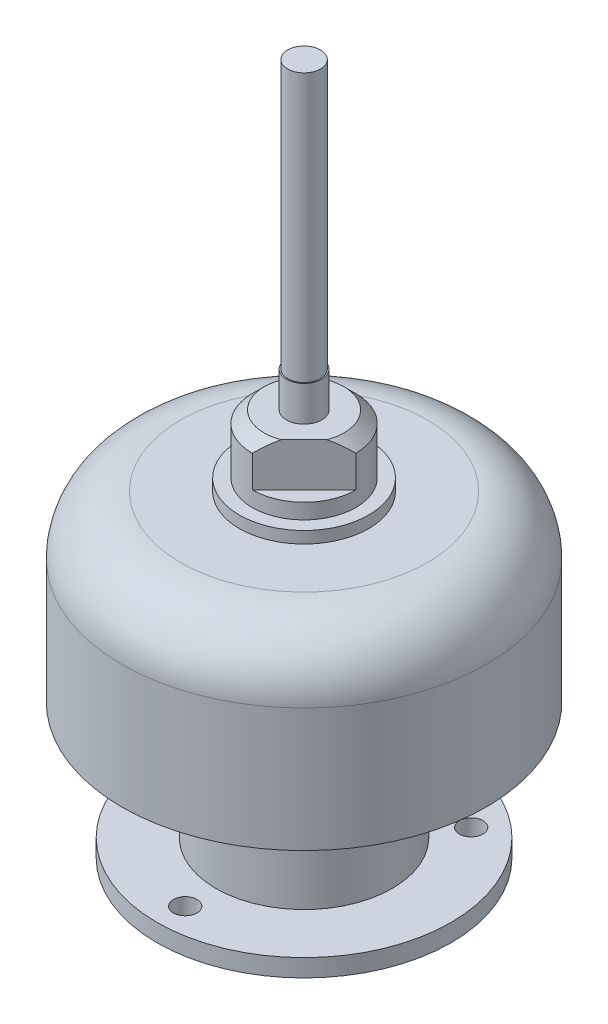
ISO-10303-21;
HEADER;
FILE_DESCRIPTION(('STEP AP214'),'2;1');
FILE_NAME('part.step','',(''),(''),'','','');
FILE_SCHEMA(('AUTOMOTIVE_DESIGN { 1 0 10303 214 1 1 1 1 }'));
ENDSEC;
DATA;
#1=APPLICATION_CONTEXT('core data for automotive mechanical design processes');
#2=APPLICATION_PROTOCOL_DEFINITION('international standard','automotive_design',2000,#1);
#3=PRODUCT_CONTEXT('',#1,'mechanical');
#4=PRODUCT('Part','Part','',(#3));
#5=PRODUCT_RELATED_PRODUCT_CATEGORY('part','',(#4));
#6=PRODUCT_DEFINITION_FORMATION('','',#4);
#7=PRODUCT_DEFINITION_CONTEXT('part definition',#1,'design');
#8=PRODUCT_DEFINITION('design','',#6,#7);
#9=PRODUCT_DEFINITION_SHAPE('','',#8);
#10=(LENGTH_UNIT() NAMED_UNIT(*) SI_UNIT(.MILLI.,.METRE.));
#11=(NAMED_UNIT(*) PLANE_ANGLE_UNIT() SI_UNIT($,.RADIAN.));
#12=(NAMED_UNIT(*) SI_UNIT($,.STERADIAN.) SOLID_ANGLE_UNIT());
#13=UNCERTAINTY_MEASURE_WITH_UNIT(LENGTH_MEASURE(1.E-05),#10,'distance_accuracy_value','');
#14=(GEOMETRIC_REPRESENTATION_CONTEXT(3) GLOBAL_UNCERTAINTY_ASSIGNED_CONTEXT((#13)) GLOBAL_UNIT_ASSIGNED_CONTEXT((#10,
#11,#12)) REPRESENTATION_CONTEXT('',''));
#15=CARTESIAN_POINT('',(0.,0.,0.));
#16=DIRECTION('',(0.,0.,1.));
#17=DIRECTION('',(1.,0.,0.));
#18=AXIS2_PLACEMENT_3D('',#15,#16,#17);
#19=CARTESIAN_POINT('',(0.,2.,0.));
#20=DIRECTION('',(0.,-1.,0.));
#21=DIRECTION('',(0.,0.,-1.));
#22=AXIS2_PLACEMENT_3D('',#19,#20,#21);
#23=PLANE('',#22);
#24=CARTESIAN_POINT('',(0.,2.,0.));
#25=DIRECTION('',(0.,-1.,0.));
#26=DIRECTION('',(0.,0.,-1.));
#27=AXIS2_PLACEMENT_3D('',#24,#25,#26);
#28=CIRCLE('',#27,4.4);
#29=CARTESIAN_POINT('',(0.,2.,-4.4));
#30=VERTEX_POINT('',#29);
#31=EDGE_CURVE('E259',#30,#30,#28,.T.);
#32=ORIENTED_EDGE('',*,*,#31,.T.);
#33=EDGE_LOOP('',(#32));
#34=FACE_BOUND('',#33,.T.);
#35=CARTESIAN_POINT('',(0.,2.,0.));
#36=DIRECTION('',(0.,-1.,0.));
#37=DIRECTION('',(0.,0.,-1.));
#38=AXIS2_PLACEMENT_3D('',#35,#36,#37);
#39=CIRCLE('',#38,1.5);
#40=CARTESIAN_POINT('',(0.,2.,-1.5));
#41=VERTEX_POINT('',#40);
#42=EDGE_CURVE('E266',#41,#41,#39,.T.);
#43=ORIENTED_EDGE('',*,*,#42,.F.);
#44=EDGE_LOOP('',(#43));
#45=FACE_BOUND('',#44,.T.);
#46=ADVANCED_FACE('F31',(#34,#45),#23,.T.);
#47=CARTESIAN_POINT('',(0.,36.,0.));
#48=DIRECTION('',(0.,1.,0.));
#49=DIRECTION('',(0.,0.,1.));
#50=AXIS2_PLACEMENT_3D('',#47,#48,#49);
#51=PLANE('',#50);
#52=CARTESIAN_POINT('',(0.,36.,0.));
#53=DIRECTION('',(0.,1.,0.));
#54=DIRECTION('',(0.,0.,1.));
#55=AXIS2_PLACEMENT_3D('',#52,#53,#54);
#56=CIRCLE('',#55,1.5);
#57=CARTESIAN_POINT('',(0.,36.,1.5));
#58=VERTEX_POINT('',#57);
#59=EDGE_CURVE('E247',#58,#58,#56,.T.);
#60=ORIENTED_EDGE('',*,*,#59,.T.);
#61=EDGE_LOOP('',(#60));
#62=FACE_BOUND('',#61,.T.);
#63=CARTESIAN_POINT('',(0.,36.,0.));
#64=DIRECTION('',(0.,1.,0.));
#65=DIRECTION('',(0.,0.,1.));
#66=AXIS2_PLACEMENT_3D('',#63,#64,#65);
#67=CIRCLE('',#66,1.4);
#68=CARTESIAN_POINT('',(0.,36.,1.4));
#69=VERTEX_POINT('',#68);
#70=EDGE_CURVE('E255',#69,#69,#67,.T.);
#71=ORIENTED_EDGE('',*,*,#70,.F.);
#72=EDGE_LOOP('',(#71));
#73=FACE_BOUND('',#72,.T.);
#74=ADVANCED_FACE('F213',(#62,#73),#51,.T.);
#75=CARTESIAN_POINT('',(0.,33.,0.));
#76=DIRECTION('',(0.,1.,0.));
#77=DIRECTION('',(0.,0.,1.));
#78=AXIS2_PLACEMENT_3D('',#75,#76,#77);
#79=PLANE('',#78);
#80=DIRECTION('',(0.707106781186548,0.,-0.707106781186548));
#81=VECTOR('',#80,1.);
#82=CARTESIAN_POINT('',(0.,33.,-4.4));
#83=LINE('',#82,#81);
#84=CARTESIAN_POINT('',(-3.16953597148326,33.,-1.23046402851675));
#85=VERTEX_POINT('',#84);
#86=CARTESIAN_POINT('',(-1.23046402851674,33.,-3.16953597148326));
#87=VERTEX_POINT('',#86);
#88=EDGE_CURVE('E109',#85,#87,#83,.T.);
#89=ORIENTED_EDGE('',*,*,#88,.F.);
#90=CARTESIAN_POINT('',(0.,33.,0.));
#91=DIRECTION('',(0.,1.,0.));
#92=DIRECTION('',(0.,0.,1.));
#93=AXIS2_PLACEMENT_3D('',#90,#91,#92);
#94=CIRCLE('',#93,3.4);
#95=CARTESIAN_POINT('',(1.23046402851674,33.,3.16953597148326));
#96=VERTEX_POINT('',#95);
#97=EDGE_CURVE('E162',#85,#96,#94,.T.);
#98=ORIENTED_EDGE('',*,*,#97,.T.);
#99=DIRECTION('',(-0.707106781186548,0.,0.707106781186548));
#100=VECTOR('',#99,1.);
#101=CARTESIAN_POINT('',(4.4,33.,0.));
#102=LINE('',#101,#100);
#103=CARTESIAN_POINT('',(3.16953597148326,33.,1.23046402851674));
#104=VERTEX_POINT('',#103);
#105=EDGE_CURVE('E94',#104,#96,#102,.T.);
#106=ORIENTED_EDGE('',*,*,#105,.F.);
#107=CARTESIAN_POINT('',(0.,33.,0.));
#108=DIRECTION('',(0.,1.,0.));
#109=DIRECTION('',(0.,0.,1.));
#110=AXIS2_PLACEMENT_3D('',#107,#108,#109);
#111=CIRCLE('',#110,3.4);
#112=EDGE_CURVE('E159',#104,#87,#111,.T.);
#113=ORIENTED_EDGE('',*,*,#112,.T.);
#114=EDGE_LOOP('',(#89,#98,#106,#113));
#115=FACE_BOUND('',#114,.T.);
#116=CARTESIAN_POINT('',(0.,33.,0.));
#117=DIRECTION('',(0.,1.,0.));
#118=DIRECTION('',(0.,0.,1.));
#119=AXIS2_PLACEMENT_3D('',#116,#117,#118);
#120=CIRCLE('',#119,1.5);
#121=CARTESIAN_POINT('',(0.,33.,1.5));
#122=VERTEX_POINT('',#121);
#123=EDGE_CURVE('E250',#122,#122,#120,.T.);
#124=ORIENTED_EDGE('',*,*,#123,.F.);
#125=EDGE_LOOP('',(#124));
#126=FACE_BOUND('',#125,.T.);
#127=ADVANCED_FACE('F189',(#115,#126),#79,.T.);
#128=CARTESIAN_POINT('',(0.,28.,0.));
#129=DIRECTION('',(0.,1.,0.));
#130=DIRECTION('',(0.,0.,1.));
#131=AXIS2_PLACEMENT_3D('',#128,#129,#130);
#132=PLANE('',#131);
#133=CARTESIAN_POINT('',(0.,28.,0.));
#134=DIRECTION('',(0.,1.,0.));
#135=DIRECTION('',(0.,0.,1.));
#136=AXIS2_PLACEMENT_3D('',#133,#134,#135);
#137=CIRCLE('',#136,5.50000000000001);
#138=CARTESIAN_POINT('',(0.,28.,5.50000000000001));
#139=VERTEX_POINT('',#138);
#140=EDGE_CURVE('E127',#139,#139,#137,.T.);
#141=ORIENTED_EDGE('',*,*,#140,.T.);
#142=EDGE_LOOP('',(#141));
#143=FACE_BOUND('',#142,.T.);
#144=CARTESIAN_POINT('',(0.,28.,0.));
#145=DIRECTION('',(0.,1.,0.));
#146=DIRECTION('',(0.,0.,1.));
#147=AXIS2_PLACEMENT_3D('',#144,#145,#146);
#148=CIRCLE('',#147,4.4);
#149=CARTESIAN_POINT('',(0.,28.,4.4));
#150=VERTEX_POINT('',#149);
#151=EDGE_CURVE('E122',#150,#150,#148,.T.);
#152=ORIENTED_EDGE('',*,*,#151,.F.);
#153=EDGE_LOOP('',(#152));
#154=FACE_BOUND('',#153,.T.);
#155=ADVANCED_FACE('F335',(#143,#154),#132,.T.);
#156=CARTESIAN_POINT('',(0.,27.,0.));
#157=DIRECTION('',(0.,1.,0.));
#158=DIRECTION('',(0.,0.,1.));
#159=AXIS2_PLACEMENT_3D('',#156,#157,#158);
#160=PLANE('',#159);
#161=CARTESIAN_POINT('',(0.,27.,0.));
#162=DIRECTION('',(0.,1.,0.));
#163=DIRECTION('',(0.,0.,1.));
#164=AXIS2_PLACEMENT_3D('',#161,#162,#163);
#165=CIRCLE('',#164,10.5);
#166=CARTESIAN_POINT('',(0.,27.,10.5));
#167=VERTEX_POINT('',#166);
#168=EDGE_CURVE('E151',#167,#167,#165,.T.);
#169=ORIENTED_EDGE('',*,*,#168,.T.);
#170=EDGE_LOOP('',(#169));
#171=FACE_BOUND('',#170,.T.);
#172=CARTESIAN_POINT('',(0.,27.,0.));
#173=DIRECTION('',(0.,1.,0.));
#174=DIRECTION('',(0.,0.,1.));
#175=AXIS2_PLACEMENT_3D('',#172,#173,#174);
#176=CIRCLE('',#175,5.50000000000001);
#177=CARTESIAN_POINT('',(0.,27.,5.50000000000001));
#178=VERTEX_POINT('',#177);
#179=EDGE_CURVE('E126',#178,#178,#176,.T.);
#180=ORIENTED_EDGE('',*,*,#179,.F.);
#181=EDGE_LOOP('',(#180));
#182=FACE_BOUND('',#181,.T.);
#183=ADVANCED_FACE('F332',(#171,#182),#160,.T.);
#184=CARTESIAN_POINT('',(0.,6.5,0.));
#185=DIRECTION('',(0.,1.,0.));
#186=DIRECTION('',(0.,0.,1.));
#187=AXIS2_PLACEMENT_3D('',#184,#185,#186);
#188=PLANE('',#187);
#189=CARTESIAN_POINT('',(0.,6.5,0.));
#190=DIRECTION('',(0.,1.,0.));
#191=DIRECTION('',(0.,0.,1.));
#192=AXIS2_PLACEMENT_3D('',#189,#190,#191);
#193=CIRCLE('',#192,7.5);
#194=CARTESIAN_POINT('',(0.,6.5,7.5));
#195=VERTEX_POINT('',#194);
#196=EDGE_CURVE('E142',#195,#195,#193,.T.);
#197=ORIENTED_EDGE('',*,*,#196,.T.);
#198=EDGE_LOOP('',(#197));
#199=FACE_BOUND('',#198,.T.);
#200=CARTESIAN_POINT('',(0.,6.5,0.));
#201=DIRECTION('',(0.,1.,0.));
#202=DIRECTION('',(0.,0.,1.));
#203=AXIS2_PLACEMENT_3D('',#200,#201,#202);
#204=CIRCLE('',#203,5.);
#205=CARTESIAN_POINT('',(0.,6.5,5.));
#206=VERTEX_POINT('',#205);
#207=EDGE_CURVE('E135',#206,#206,#204,.T.);
#208=ORIENTED_EDGE('',*,*,#207,.F.);
#209=EDGE_LOOP('',(#208));
#210=FACE_BOUND('',#209,.T.);
#211=ADVANCED_FACE('F313',(#199,#210),#188,.T.);
#212=CARTESIAN_POINT('',(0.,1.5,0.));
#213=DIRECTION('',(0.,1.,0.));
#214=DIRECTION('',(0.,0.,1.));
#215=AXIS2_PLACEMENT_3D('',#212,#213,#214);
#216=PLANE('',#215);
#217=CARTESIAN_POINT('',(-6.35,1.5,-7.85772410593551));
#218=DIRECTION('',(0.,1.,0.));
#219=DIRECTION('',(0.,0.,1.));
#220=AXIS2_PLACEMENT_3D('',#217,#218,#219);
#221=CIRCLE('',#220,1.);
#222=CARTESIAN_POINT('',(-6.35,1.5,-6.85772410593551));
#223=VERTEX_POINT('',#222);
#224=EDGE_CURVE('E283',#223,#223,#221,.F.);
#225=ORIENTED_EDGE('',*,*,#224,.T.);
#226=EDGE_LOOP('',(#225));
#227=FACE_BOUND('',#226,.T.);
#228=CARTESIAN_POINT('',(6.35,1.5,-7.85772410593551));
#229=DIRECTION('',(0.,1.,0.));
#230=DIRECTION('',(0.,0.,1.));
#231=AXIS2_PLACEMENT_3D('',#228,#229,#230);
#232=CIRCLE('',#231,1.);
#233=CARTESIAN_POINT('',(6.35,1.5,-6.85772410593551));
#234=VERTEX_POINT('',#233);
#235=EDGE_CURVE('E277',#234,#234,#232,.F.);
#236=ORIENTED_EDGE('',*,*,#235,.T.);
#237=EDGE_LOOP('',(#236));
#238=FACE_BOUND('',#237,.T.);
#239=CARTESIAN_POINT('',(0.,1.5,10.1027881362028));
#240=DIRECTION('',(0.,1.,0.));
#241=DIRECTION('',(0.,0.,1.));
#242=AXIS2_PLACEMENT_3D('',#239,#240,#241);
#243=CIRCLE('',#242,1.);
#244=CARTESIAN_POINT('',(0.,1.5,11.1027881362028));
#245=VERTEX_POINT('',#244);
#246=EDGE_CURVE('E274',#245,#245,#243,.F.);
#247=ORIENTED_EDGE('',*,*,#246,.T.);
#248=EDGE_LOOP('',(#247));
#249=FACE_BOUND('',#248,.T.);
#250=CARTESIAN_POINT('',(0.,1.5,0.));
#251=DIRECTION('',(0.,1.,0.));
#252=DIRECTION('',(0.,0.,1.));
#253=AXIS2_PLACEMENT_3D('',#250,#251,#252);
#254=CIRCLE('',#253,12.5);
#255=CARTESIAN_POINT('',(0.,1.5,12.5));
#256=VERTEX_POINT('',#255);
#257=EDGE_CURVE('E148',#256,#256,#254,.T.);
#258=ORIENTED_EDGE('',*,*,#257,.T.);
#259=EDGE_LOOP('',(#258));
#260=FACE_BOUND('',#259,.T.);
#261=CARTESIAN_POINT('',(0.,1.5,0.));
#262=DIRECTION('',(0.,1.,0.));
#263=DIRECTION('',(0.,0.,1.));
#264=AXIS2_PLACEMENT_3D('',#261,#262,#263);
#265=CIRCLE('',#264,7.5);
#266=CARTESIAN_POINT('',(0.,1.5,7.5));
#267=VERTEX_POINT('',#266);
#268=EDGE_CURVE('E139',#267,#267,#265,.T.);
#269=ORIENTED_EDGE('',*,*,#268,.F.);
#270=EDGE_LOOP('',(#269));
#271=FACE_BOUND('',#270,.T.);
#272=ADVANCED_FACE('F307',(#227,#238,#249,#260,#271),#216,.T.);
#273=CARTESIAN_POINT('',(0.,1.5,0.));
#274=DIRECTION('',(0.,-1.,0.));
#275=DIRECTION('',(0.,0.,-1.));
#276=AXIS2_PLACEMENT_3D('',#273,#274,#275);
#277=CYLINDRICAL_SURFACE('',#276,12.5);
#278=ORIENTED_EDGE('',*,*,#257,.F.);
#279=EDGE_LOOP('',(#278));
#280=FACE_BOUND('',#279,.T.);
#281=CARTESIAN_POINT('',(0.,0.,0.));
#282=DIRECTION('',(0.,1.,0.));
#283=DIRECTION('',(0.,0.,1.));
#284=AXIS2_PLACEMENT_3D('',#281,#282,#283);
#285=CIRCLE('',#284,12.5);
#286=CARTESIAN_POINT('',(0.,0.,12.5));
#287=VERTEX_POINT('',#286);
#288=EDGE_CURVE('E145',#287,#287,#285,.T.);
#289=ORIENTED_EDGE('',*,*,#288,.T.);
#290=EDGE_LOOP('',(#289));
#291=FACE_BOUND('',#290,.T.);
#292=ADVANCED_FACE('F296',(#280,#291),#277,.T.);
#293=CARTESIAN_POINT('',(0.,0.,0.));
#294=DIRECTION('',(0.,1.,0.));
#295=DIRECTION('',(0.,0.,1.));
#296=AXIS2_PLACEMENT_3D('',#293,#294,#295);
#297=PLANE('',#296);
#298=CARTESIAN_POINT('',(-6.35,0.,-7.85772410593551));
#299=DIRECTION('',(0.,-1.,0.));
#300=DIRECTION('',(0.,0.,-1.));
#301=AXIS2_PLACEMENT_3D('',#298,#299,#300);
#302=CIRCLE('',#301,1.);
#303=CARTESIAN_POINT('',(-6.35,0.,-8.85772410593551));
#304=VERTEX_POINT('',#303);
#305=EDGE_CURVE('E286',#304,#304,#302,.T.);
#306=ORIENTED_EDGE('',*,*,#305,.F.);
#307=EDGE_LOOP('',(#306));
#308=FACE_BOUND('',#307,.T.);
#309=CARTESIAN_POINT('',(6.35,0.,-7.85772410593551));
#310=DIRECTION('',(0.,-1.,0.));
#311=DIRECTION('',(0.,0.,-1.));
#312=AXIS2_PLACEMENT_3D('',#309,#310,#311);
#313=CIRCLE('',#312,1.);
#314=CARTESIAN_POINT('',(6.35,0.,-8.85772410593551));
#315=VERTEX_POINT('',#314);
#316=EDGE_CURVE('E280',#315,#315,#313,.T.);
#317=ORIENTED_EDGE('',*,*,#316,.F.);
#318=EDGE_LOOP('',(#317));
#319=FACE_BOUND('',#318,.T.);
#320=CARTESIAN_POINT('',(0.,0.,10.1027881362028));
#321=DIRECTION('',(0.,-1.,0.));
#322=DIRECTION('',(0.,0.,-1.));
#323=AXIS2_PLACEMENT_3D('',#320,#321,#322);
#324=CIRCLE('',#323,1.);
#325=CARTESIAN_POINT('',(0.,0.,9.1027881362028));
#326=VERTEX_POINT('',#325);
#327=EDGE_CURVE('E269',#326,#326,#324,.T.);
#328=ORIENTED_EDGE('',*,*,#327,.F.);
#329=EDGE_LOOP('',(#328));
#330=FACE_BOUND('',#329,.T.);
#331=CARTESIAN_POINT('',(0.,0.,0.));
#332=DIRECTION('',(0.,-1.,0.));
#333=DIRECTION('',(0.,0.,-1.));
#334=AXIS2_PLACEMENT_3D('',#331,#332,#333);
#335=CIRCLE('',#334,4.4);
#336=CARTESIAN_POINT('',(0.,0.,-4.4));
#337=VERTEX_POINT('',#336);
#338=EDGE_CURVE('E261',#337,#337,#335,.T.);
#339=ORIENTED_EDGE('',*,*,#338,.F.);
#340=EDGE_LOOP('',(#339));
#341=FACE_BOUND('',#340,.T.);
#342=ORIENTED_EDGE('',*,*,#288,.F.);
#343=EDGE_LOOP('',(#342));
#344=FACE_BOUND('',#343,.T.);
#345=ADVANCED_FACE('F292',(#308,#319,#330,#341,#344),#297,.F.);
#346=CARTESIAN_POINT('',(0.,6.5,0.));
#347=DIRECTION('',(0.,-1.,0.));
#348=DIRECTION('',(0.,0.,-1.));
#349=AXIS2_PLACEMENT_3D('',#346,#347,#348);
#350=CYLINDRICAL_SURFACE('',#349,7.5);
#351=ORIENTED_EDGE('',*,*,#196,.F.);
#352=EDGE_LOOP('',(#351));
#353=FACE_BOUND('',#352,.T.);
#354=ORIENTED_EDGE('',*,*,#268,.T.);
#355=EDGE_LOOP('',(#354));
#356=FACE_BOUND('',#355,.T.);
#357=ADVANCED_FACE('F295',(#353,#356),#350,.T.);
#358=CARTESIAN_POINT('',(0.,11.5,0.));
#359=DIRECTION('',(0.,-1.,0.));
#360=DIRECTION('',(0.,0.,-1.));
#361=AXIS2_PLACEMENT_3D('',#358,#359,#360);
#362=CYLINDRICAL_SURFACE('',#361,5.);
#363=CARTESIAN_POINT('',(0.,11.5,0.));
#364=DIRECTION('',(0.,1.,0.));
#365=DIRECTION('',(0.,0.,1.));
#366=AXIS2_PLACEMENT_3D('',#363,#364,#365);
#367=CIRCLE('',#366,5.);
#368=CARTESIAN_POINT('',(0.,11.5,5.));
#369=VERTEX_POINT('',#368);
#370=EDGE_CURVE('E136',#369,#369,#367,.T.);
#371=ORIENTED_EDGE('',*,*,#370,.F.);
#372=EDGE_LOOP('',(#371));
#373=FACE_BOUND('',#372,.T.);
#374=ORIENTED_EDGE('',*,*,#207,.T.);
#375=EDGE_LOOP('',(#374));
#376=FACE_BOUND('',#375,.T.);
#377=ADVANCED_FACE('F355',(#373,#376),#362,.T.);
#378=CARTESIAN_POINT('',(0.,11.5,0.));
#379=DIRECTION('',(0.,1.,0.));
#380=DIRECTION('',(0.,0.,1.));
#381=AXIS2_PLACEMENT_3D('',#378,#379,#380);
#382=PLANE('',#381);
#383=CARTESIAN_POINT('',(0.,11.5,0.));
#384=DIRECTION('',(0.,1.,0.));
#385=DIRECTION('',(0.,0.,1.));
#386=AXIS2_PLACEMENT_3D('',#383,#384,#385);
#387=CIRCLE('',#386,15.5);
#388=CARTESIAN_POINT('',(0.,11.5,15.5));
#389=VERTEX_POINT('',#388);
#390=EDGE_CURVE('E130',#389,#389,#387,.T.);
#391=ORIENTED_EDGE('',*,*,#390,.F.);
#392=EDGE_LOOP('',(#391));
#393=FACE_BOUND('',#392,.T.);
#394=ORIENTED_EDGE('',*,*,#370,.T.);
#395=EDGE_LOOP('',(#394));
#396=FACE_BOUND('',#395,.T.);
#397=ADVANCED_FACE('F348',(#393,#396),#382,.F.);
#398=CARTESIAN_POINT('',(0.,27.,0.));
#399=DIRECTION('',(0.,-1.,0.));
#400=DIRECTION('',(0.,0.,-1.));
#401=AXIS2_PLACEMENT_3D('',#398,#399,#400);
#402=CYLINDRICAL_SURFACE('',#401,15.5);
#403=CARTESIAN_POINT('',(0.,22.,0.));
#404=DIRECTION('',(0.,1.,0.));
#405=DIRECTION('',(0.,0.,1.));
#406=AXIS2_PLACEMENT_3D('',#403,#404,#405);
#407=CIRCLE('',#406,15.5);
#408=CARTESIAN_POINT('',(0.,22.,15.5));
#409=VERTEX_POINT('',#408);
#410=EDGE_CURVE('E156',#409,#409,#407,.F.);
#411=ORIENTED_EDGE('',*,*,#410,.T.);
#412=EDGE_LOOP('',(#411));
#413=FACE_BOUND('',#412,.T.);
#414=ORIENTED_EDGE('',*,*,#390,.T.);
#415=EDGE_LOOP('',(#414));
#416=FACE_BOUND('',#415,.T.);
#417=ADVANCED_FACE('F341',(#413,#416),#402,.T.);
#418=CARTESIAN_POINT('',(0.,28.,0.));
#419=DIRECTION('',(0.,-1.,0.));
#420=DIRECTION('',(0.,0.,-1.));
#421=AXIS2_PLACEMENT_3D('',#418,#419,#420);
#422=CYLINDRICAL_SURFACE('',#421,5.50000000000001);
#423=ORIENTED_EDGE('',*,*,#140,.F.);
#424=EDGE_LOOP('',(#423));
#425=FACE_BOUND('',#424,.T.);
#426=ORIENTED_EDGE('',*,*,#179,.T.);
#427=EDGE_LOOP('',(#426));
#428=FACE_BOUND('',#427,.T.);
#429=ADVANCED_FACE('F339',(#425,#428),#422,.T.);
#430=CARTESIAN_POINT('',(0.,33.,0.));
#431=DIRECTION('',(0.,-1.,0.));
#432=DIRECTION('',(0.,0.,-1.));
#433=AXIS2_PLACEMENT_3D('',#430,#431,#432);
#434=CYLINDRICAL_SURFACE('',#433,4.4);
#435=DIRECTION('',(0.,1.,0.));
#436=VECTOR('',#435,1.);
#437=CARTESIAN_POINT('',(0.,29.3,4.4));
#438=LINE('',#437,#436);
#439=CARTESIAN_POINT('',(0.,29.3,4.4));
#440=VERTEX_POINT('',#439);
#441=CARTESIAN_POINT('',(0.,32.,4.4));
#442=VERTEX_POINT('',#441);
#443=EDGE_CURVE('E102',#440,#442,#438,.T.);
#444=ORIENTED_EDGE('',*,*,#443,.T.);
#445=CARTESIAN_POINT('',(0.,32.,0.));
#446=DIRECTION('',(0.,1.,0.));
#447=DIRECTION('',(0.,0.,1.));
#448=AXIS2_PLACEMENT_3D('',#445,#446,#447);
#449=CIRCLE('',#448,4.4);
#450=CARTESIAN_POINT('',(-4.4,32.,0.));
#451=VERTEX_POINT('',#450);
#452=EDGE_CURVE('E58',#442,#451,#449,.F.);
#453=ORIENTED_EDGE('',*,*,#452,.T.);
#454=DIRECTION('',(0.,1.,0.));
#455=VECTOR('',#454,1.);
#456=CARTESIAN_POINT('',(-4.4,29.3,0.));
#457=LINE('',#456,#455);
#458=CARTESIAN_POINT('',(-4.4,29.3,0.));
#459=VERTEX_POINT('',#458);
#460=EDGE_CURVE('E118',#459,#451,#457,.T.);
#461=ORIENTED_EDGE('',*,*,#460,.F.);
#462=CARTESIAN_POINT('',(0.,29.3,0.));
#463=DIRECTION('',(0.,1.,0.));
#464=DIRECTION('',(0.,0.,-1.));
#465=AXIS2_PLACEMENT_3D('',#462,#463,#464);
#466=CIRCLE('',#465,4.4);
#467=CARTESIAN_POINT('',(0.,29.3,-4.4));
#468=VERTEX_POINT('',#467);
#469=EDGE_CURVE('E113',#468,#459,#466,.T.);
#470=ORIENTED_EDGE('',*,*,#469,.F.);
#471=DIRECTION('',(0.,1.,0.));
#472=VECTOR('',#471,1.);
#473=CARTESIAN_POINT('',(0.,29.3,-4.4));
#474=LINE('',#473,#472);
#475=CARTESIAN_POINT('',(0.,32.,-4.4));
#476=VERTEX_POINT('',#475);
#477=EDGE_CURVE('E120',#468,#476,#474,.T.);
#478=ORIENTED_EDGE('',*,*,#477,.T.);
#479=CARTESIAN_POINT('',(0.,32.,0.));
#480=DIRECTION('',(0.,1.,0.));
#481=DIRECTION('',(0.,0.,1.));
#482=AXIS2_PLACEMENT_3D('',#479,#480,#481);
#483=CIRCLE('',#482,4.4);
#484=CARTESIAN_POINT('',(4.4,32.,0.));
#485=VERTEX_POINT('',#484);
#486=EDGE_CURVE('E107',#476,#485,#483,.F.);
#487=ORIENTED_EDGE('',*,*,#486,.T.);
#488=DIRECTION('',(0.,1.,0.));
#489=VECTOR('',#488,1.);
#490=CARTESIAN_POINT('',(4.4,29.3,0.));
#491=LINE('',#490,#489);
#492=CARTESIAN_POINT('',(4.4,29.3,0.));
#493=VERTEX_POINT('',#492);
#494=EDGE_CURVE('E100',#493,#485,#491,.T.);
#495=ORIENTED_EDGE('',*,*,#494,.F.);
#496=CARTESIAN_POINT('',(0.,29.3,0.));
#497=DIRECTION('',(0.,1.,0.));
#498=DIRECTION('',(0.,0.,-1.));
#499=AXIS2_PLACEMENT_3D('',#496,#497,#498);
#500=CIRCLE('',#499,4.4);
#501=EDGE_CURVE('E89',#440,#493,#500,.T.);
#502=ORIENTED_EDGE('',*,*,#501,.F.);
#503=EDGE_LOOP('',(#444,#453,#461,#470,#478,#487,#495,#502));
#504=FACE_BOUND('',#503,.T.);
#505=ORIENTED_EDGE('',*,*,#151,.T.);
#506=EDGE_LOOP('',(#505));
#507=FACE_BOUND('',#506,.T.);
#508=ADVANCED_FACE('F104',(#504,#507),#434,.T.);
#509=CARTESIAN_POINT('',(0.,29.3,-4.4));
#510=DIRECTION('',(0.707106781186548,0.,0.707106781186548));
#511=DIRECTION('',(0.707106781186548,0.,-0.707106781186548));
#512=AXIS2_PLACEMENT_3D('',#509,#510,#511);
#513=PLANE('',#512);
#514=ORIENTED_EDGE('',*,*,#460,.T.);
#515=CARTESIAN_POINT('',(-4.4,32.,0.));
#516=CARTESIAN_POINT('',(-4.35157240135971,32.0484232481934,-0.0484275986402869));
#517=CARTESIAN_POINT('',(-4.30288296401659,32.0963186393039,-0.0971170359834119));
#518=CARTESIAN_POINT('',(-4.20490284844122,32.1908787340729,-0.195097151558786));
#519=CARTESIAN_POINT('',(-4.15561210463658,32.2375433017237,-0.244387895363424));
#520=CARTESIAN_POINT('',(-4.00706327318836,32.375110816406,-0.392936726811638));
#521=CARTESIAN_POINT('',(-3.90681167413921,32.4639077274469,-0.493188325860793));
#522=CARTESIAN_POINT('',(-3.75392964765335,32.591323162943,-0.646070352346653));
#523=CARTESIAN_POINT('',(-3.70251260258818,32.6328602113223,-0.697487397411822));
#524=CARTESIAN_POINT('',(-3.5987817523367,32.7136159329106,-0.801218247663301));
#525=CARTESIAN_POINT('',(-3.54646807509724,32.7528349334034,-0.853531924902759));
#526=CARTESIAN_POINT('',(-3.44069005597861,32.8286628451223,-0.95930994402139));
#527=CARTESIAN_POINT('',(-3.38722261617009,32.8652631717806,-1.01277738382991));
#528=CARTESIAN_POINT('',(-3.27920298842775,32.9352104113098,-1.12079701157225));
#529=CARTESIAN_POINT('',(-3.22465024632887,32.9685556079409,-1.17534975367113));
#530=CARTESIAN_POINT('',(-3.16953597148326,33.,-1.23046402851675));
#531=B_SPLINE_CURVE_WITH_KNOTS('',3,(#515,#516,#517,#518,#519,#520,#521,#522,#523,#524,#525,
#526,#527,#528,#529,#530),.UNSPECIFIED.,.F.,.F.,(4,2,2,2,2,2,2,4),(0.,0.251620401060455,
0.503268491031504,1.0049132103006,1.25610716903917,1.50726557671807,1.75921281558452,
2.01129218205459),.UNSPECIFIED.);
#532=EDGE_CURVE('E11',#451,#85,#531,.T.);
#533=ORIENTED_EDGE('',*,*,#532,.T.);
#534=ORIENTED_EDGE('',*,*,#88,.T.);
#535=CARTESIAN_POINT('',(-1.23046402851674,33.,-3.16953597148326));
#536=CARTESIAN_POINT('',(-1.17534975367112,32.9685556079409,-3.22465024632888));
#537=CARTESIAN_POINT('',(-1.12079701157225,32.9352104113098,-3.27920298842776));
#538=CARTESIAN_POINT('',(-1.0127773838299,32.8652631717806,-3.3872226161701));
#539=CARTESIAN_POINT('',(-0.959309944021383,32.8286628451223,-3.44069005597862));
#540=CARTESIAN_POINT('',(-0.853531924902752,32.7528349334034,-3.54646807509725));
#541=CARTESIAN_POINT('',(-0.801218247663294,32.7136159329106,-3.59878175233671));
#542=CARTESIAN_POINT('',(-0.697487397411816,32.6328602113223,-3.70251260258819));
#543=CARTESIAN_POINT('',(-0.646070352346648,32.591323162943,-3.75392964765335));
#544=CARTESIAN_POINT('',(-0.493188325860792,32.4639077274469,-3.90681167413921));
#545=CARTESIAN_POINT('',(-0.392936726811637,32.3751108164061,-4.00706327318836));
#546=CARTESIAN_POINT('',(-0.244387895363424,32.2375433017237,-4.15561210463658));
#547=CARTESIAN_POINT('',(-0.195097151558787,32.1908787340729,-4.20490284844121));
#548=CARTESIAN_POINT('',(-0.0971170359834127,32.0963186393039,-4.30288296401659));
#549=CARTESIAN_POINT('',(-0.0484275986402877,32.0484232481934,-4.35157240135971));
#550=CARTESIAN_POINT('',(0.,32.,-4.4));
#551=B_SPLINE_CURVE_WITH_KNOTS('',3,(#535,#536,#537,#538,#539,#540,#541,#542,#543,#544,#545,
#546,#547,#548,#549,#550),.UNSPECIFIED.,.F.,.F.,(4,2,2,2,2,2,2,4),(0.,0.252079366470066,
0.504026605336515,0.755185013015415,1.00637897175398,1.50802369102307,1.75967178099412,
2.01129218205457),.UNSPECIFIED.);
#552=EDGE_CURVE('E44',#87,#476,#551,.T.);
#553=ORIENTED_EDGE('',*,*,#552,.T.);
#554=ORIENTED_EDGE('',*,*,#477,.F.);
#555=DIRECTION('',(0.707106781186548,0.,-0.707106781186548));
#556=VECTOR('',#555,1.);
#557=CARTESIAN_POINT('',(0.,29.3,-4.4));
#558=LINE('',#557,#556);
#559=EDGE_CURVE('E115',#459,#468,#558,.T.);
#560=ORIENTED_EDGE('',*,*,#559,.F.);
#561=EDGE_LOOP('',(#514,#533,#534,#553,#554,#560));
#562=FACE_BOUND('',#561,.T.);
#563=ADVANCED_FACE('F184',(#562),#513,.F.);
#564=CARTESIAN_POINT('',(0.,29.3,0.));
#565=DIRECTION('',(0.,-1.,0.));
#566=DIRECTION('',(0.,0.,-1.));
#567=AXIS2_PLACEMENT_3D('',#564,#565,#566);
#568=PLANE('',#567);
#569=ORIENTED_EDGE('',*,*,#469,.T.);
#570=ORIENTED_EDGE('',*,*,#559,.T.);
#571=EDGE_LOOP('',(#569,#570));
#572=FACE_BOUND('',#571,.T.);
#573=ADVANCED_FACE('F180',(#572),#568,.F.);
#574=CARTESIAN_POINT('',(4.4,29.3,0.));
#575=DIRECTION('',(-0.707106781186548,0.,-0.707106781186548));
#576=DIRECTION('',(-0.707106781186548,0.,0.707106781186548));
#577=AXIS2_PLACEMENT_3D('',#574,#575,#576);
#578=PLANE('',#577);
#579=ORIENTED_EDGE('',*,*,#105,.T.);
#580=CARTESIAN_POINT('',(1.23046402851674,33.,3.16953597148326));
#581=CARTESIAN_POINT('',(1.17534975367113,32.9685556079409,3.22465024632887));
#582=CARTESIAN_POINT('',(1.12079701157225,32.9352104113098,3.27920298842775));
#583=CARTESIAN_POINT('',(1.01277738382991,32.8652631717806,3.38722261617009));
#584=CARTESIAN_POINT('',(0.95930994402139,32.8286628451223,3.44069005597861));
#585=CARTESIAN_POINT('',(0.853531924902759,32.7528349334034,3.54646807509724));
#586=CARTESIAN_POINT('',(0.801218247663301,32.7136159329106,3.5987817523367));
#587=CARTESIAN_POINT('',(0.697487397411821,32.6328602113223,3.70251260258818));
#588=CARTESIAN_POINT('',(0.646070352346652,32.591323162943,3.75392964765335));
#589=CARTESIAN_POINT('',(0.493188325860793,32.4639077274469,3.90681167413921));
#590=CARTESIAN_POINT('',(0.392936726811637,32.375110816406,4.00706327318836));
#591=CARTESIAN_POINT('',(0.244387895363423,32.2375433017237,4.15561210463658));
#592=CARTESIAN_POINT('',(0.195097151558785,32.1908787340729,4.20490284844122));
#593=CARTESIAN_POINT('',(0.0971170359834116,32.0963186393039,4.30288296401659));
#594=CARTESIAN_POINT('',(0.0484275986402867,32.0484232481934,4.35157240135971));
#595=CARTESIAN_POINT('',(0.,32.,4.4));
#596=B_SPLINE_CURVE_WITH_KNOTS('',3,(#580,#581,#582,#583,#584,#585,#586,#587,#588,#589,#590,
#591,#592,#593,#594,#595),.UNSPECIFIED.,.F.,.F.,(4,2,2,2,2,2,2,4),(0.,0.252079366470067,
0.504026605336517,0.755185013015421,1.00637897175399,1.50802369102309,1.75967178099414,
2.01129218205459),.UNSPECIFIED.);
#597=EDGE_CURVE('E171',#96,#442,#596,.T.);
#598=ORIENTED_EDGE('',*,*,#597,.T.);
#599=ORIENTED_EDGE('',*,*,#443,.F.);
#600=DIRECTION('',(-0.707106781186548,0.,0.707106781186548));
#601=VECTOR('',#600,1.);
#602=CARTESIAN_POINT('',(4.4,29.3,0.));
#603=LINE('',#602,#601);
#604=EDGE_CURVE('E92',#493,#440,#603,.T.);
#605=ORIENTED_EDGE('',*,*,#604,.F.);
#606=ORIENTED_EDGE('',*,*,#494,.T.);
#607=CARTESIAN_POINT('',(4.4,32.,0.));
#608=CARTESIAN_POINT('',(4.35157240135971,32.0484232481934,0.0484275986402872));
#609=CARTESIAN_POINT('',(4.30288296401659,32.0963186393039,0.0971170359834122));
#610=CARTESIAN_POINT('',(4.20490284844121,32.1908787340729,0.195097151558786));
#611=CARTESIAN_POINT('',(4.15561210463658,32.2375433017237,0.244387895363424));
#612=CARTESIAN_POINT('',(4.00706327318836,32.3751108164061,0.392936726811637));
#613=CARTESIAN_POINT('',(3.90681167413921,32.4639077274469,0.493188325860792));
#614=CARTESIAN_POINT('',(3.75392964765335,32.591323162943,0.646070352346648));
#615=CARTESIAN_POINT('',(3.70251260258819,32.6328602113223,0.697487397411815));
#616=CARTESIAN_POINT('',(3.59878175233671,32.7136159329106,0.801218247663294));
#617=CARTESIAN_POINT('',(3.54646807509725,32.7528349334034,0.853531924902752));
#618=CARTESIAN_POINT('',(3.44069005597862,32.8286628451223,0.959309944021382));
#619=CARTESIAN_POINT('',(3.3872226161701,32.8652631717806,1.0127773838299));
#620=CARTESIAN_POINT('',(3.27920298842776,32.9352104113098,1.12079701157225));
#621=CARTESIAN_POINT('',(3.22465024632888,32.9685556079409,1.17534975367112));
#622=CARTESIAN_POINT('',(3.16953597148327,33.,1.23046402851674));
#623=B_SPLINE_CURVE_WITH_KNOTS('',3,(#607,#608,#609,#610,#611,#612,#613,#614,#615,#616,#617,
#618,#619,#620,#621,#622),.UNSPECIFIED.,.F.,.F.,(4,2,2,2,2,2,2,4),(0.,0.251620401060456,
0.503268491031505,1.00491321030059,1.25610716903916,1.50726557671806,1.75921281558451,
2.01129218205457),.UNSPECIFIED.);
#624=EDGE_CURVE('E165',#485,#104,#623,.T.);
#625=ORIENTED_EDGE('',*,*,#624,.T.);
#626=EDGE_LOOP('',(#579,#598,#599,#605,#606,#625));
#627=FACE_BOUND('',#626,.T.);
#628=ADVANCED_FACE('F99',(#627),#578,.F.);
#629=CARTESIAN_POINT('',(0.,29.3,0.));
#630=DIRECTION('',(0.,-1.,0.));
#631=DIRECTION('',(0.,0.,-1.));
#632=AXIS2_PLACEMENT_3D('',#629,#630,#631);
#633=PLANE('',#632);
#634=ORIENTED_EDGE('',*,*,#501,.T.);
#635=ORIENTED_EDGE('',*,*,#604,.T.);
#636=EDGE_LOOP('',(#634,#635));
#637=FACE_BOUND('',#636,.T.);
#638=ADVANCED_FACE('F91',(#637),#633,.F.);
#639=CARTESIAN_POINT('',(0.,36.,0.));
#640=DIRECTION('',(0.,-1.,0.));
#641=DIRECTION('',(0.,0.,-1.));
#642=AXIS2_PLACEMENT_3D('',#639,#640,#641);
#643=CYLINDRICAL_SURFACE('',#642,1.5);
#644=ORIENTED_EDGE('',*,*,#59,.F.);
#645=EDGE_LOOP('',(#644));
#646=FACE_BOUND('',#645,.T.);
#647=ORIENTED_EDGE('',*,*,#123,.T.);
#648=EDGE_LOOP('',(#647));
#649=FACE_BOUND('',#648,.T.);
#650=ADVANCED_FACE('F237',(#646,#649),#643,.T.);
#651=CARTESIAN_POINT('',(0.,58.8,0.));
#652=DIRECTION('',(0.,-1.,0.));
#653=DIRECTION('',(0.,0.,-1.));
#654=AXIS2_PLACEMENT_3D('',#651,#652,#653);
#655=CYLINDRICAL_SURFACE('',#654,1.4);
#656=CARTESIAN_POINT('',(0.,58.8,0.));
#657=DIRECTION('',(0.,1.,0.));
#658=DIRECTION('',(0.,0.,1.));
#659=AXIS2_PLACEMENT_3D('',#656,#657,#658);
#660=CIRCLE('',#659,1.4);
#661=CARTESIAN_POINT('',(0.,58.8,1.4));
#662=VERTEX_POINT('',#661);
#663=EDGE_CURVE('E251',#662,#662,#660,.T.);
#664=ORIENTED_EDGE('',*,*,#663,.F.);
#665=EDGE_LOOP('',(#664));
#666=FACE_BOUND('',#665,.T.);
#667=ORIENTED_EDGE('',*,*,#70,.T.);
#668=EDGE_LOOP('',(#667));
#669=FACE_BOUND('',#668,.T.);
#670=ADVANCED_FACE('F234',(#666,#669),#655,.T.);
#671=CARTESIAN_POINT('',(0.,58.8,0.));
#672=DIRECTION('',(0.,1.,0.));
#673=DIRECTION('',(0.,0.,1.));
#674=AXIS2_PLACEMENT_3D('',#671,#672,#673);
#675=PLANE('',#674);
#676=ORIENTED_EDGE('',*,*,#663,.T.);
#677=EDGE_LOOP('',(#676));
#678=FACE_BOUND('',#677,.T.);
#679=ADVANCED_FACE('F230',(#678),#675,.T.);
#680=CARTESIAN_POINT('',(0.,2.,0.));
#681=DIRECTION('',(0.,-1.,0.));
#682=DIRECTION('',(0.,0.,-1.));
#683=AXIS2_PLACEMENT_3D('',#680,#681,#682);
#684=CYLINDRICAL_SURFACE('',#683,4.4);
#685=ORIENTED_EDGE('',*,*,#31,.F.);
#686=EDGE_LOOP('',(#685));
#687=FACE_BOUND('',#686,.T.);
#688=ORIENTED_EDGE('',*,*,#338,.T.);
#689=EDGE_LOOP('',(#688));
#690=FACE_BOUND('',#689,.T.);
#691=ADVANCED_FACE('F227',(#687,#690),#684,.F.);
#692=CARTESIAN_POINT('',(0.,-1.3,0.));
#693=DIRECTION('',(0.,1.,0.));
#694=DIRECTION('',(0.,0.,1.));
#695=AXIS2_PLACEMENT_3D('',#692,#693,#694);
#696=CYLINDRICAL_SURFACE('',#695,1.5);
#697=CARTESIAN_POINT('',(0.,-1.3,0.));
#698=DIRECTION('',(0.,-1.,0.));
#699=DIRECTION('',(0.,0.,-1.));
#700=AXIS2_PLACEMENT_3D('',#697,#698,#699);
#701=CIRCLE('',#700,1.5);
#702=CARTESIAN_POINT('',(0.,-1.3,-1.5));
#703=VERTEX_POINT('',#702);
#704=EDGE_CURVE('E264',#703,#703,#701,.T.);
#705=ORIENTED_EDGE('',*,*,#704,.F.);
#706=EDGE_LOOP('',(#705));
#707=FACE_BOUND('',#706,.T.);
#708=ORIENTED_EDGE('',*,*,#42,.T.);
#709=EDGE_LOOP('',(#708));
#710=FACE_BOUND('',#709,.T.);
#711=ADVANCED_FACE('F225',(#707,#710),#696,.T.);
#712=CARTESIAN_POINT('',(0.,-1.3,0.));
#713=DIRECTION('',(0.,-1.,0.));
#714=DIRECTION('',(0.,0.,-1.));
#715=AXIS2_PLACEMENT_3D('',#712,#713,#714);
#716=PLANE('',#715);
#717=ORIENTED_EDGE('',*,*,#704,.T.);
#718=EDGE_LOOP('',(#717));
#719=FACE_BOUND('',#718,.T.);
#720=ADVANCED_FACE('F488',(#719),#716,.T.);
#721=CARTESIAN_POINT('',(0.,58.801,10.1027881362028));
#722=DIRECTION('',(0.,-1.,0.));
#723=DIRECTION('',(0.,0.,-1.));
#724=AXIS2_PLACEMENT_3D('',#721,#722,#723);
#725=CYLINDRICAL_SURFACE('',#724,1.);
#726=ORIENTED_EDGE('',*,*,#246,.F.);
#727=EDGE_LOOP('',(#726));
#728=FACE_BOUND('',#727,.T.);
#729=ORIENTED_EDGE('',*,*,#327,.T.);
#730=EDGE_LOOP('',(#729));
#731=FACE_BOUND('',#730,.T.);
#732=ADVANCED_FACE('F497',(#728,#731),#725,.F.);
#733=CARTESIAN_POINT('',(6.35,58.801,-7.85772410593551));
#734=DIRECTION('',(0.,-1.,0.));
#735=DIRECTION('',(0.,0.,-1.));
#736=AXIS2_PLACEMENT_3D('',#733,#734,#735);
#737=CYLINDRICAL_SURFACE('',#736,1.);
#738=ORIENTED_EDGE('',*,*,#235,.F.);
#739=EDGE_LOOP('',(#738));
#740=FACE_BOUND('',#739,.T.);
#741=ORIENTED_EDGE('',*,*,#316,.T.);
#742=EDGE_LOOP('',(#741));
#743=FACE_BOUND('',#742,.T.);
#744=ADVANCED_FACE('F325',(#740,#743),#737,.F.);
#745=CARTESIAN_POINT('',(-6.35,58.801,-7.85772410593551));
#746=DIRECTION('',(0.,-1.,0.));
#747=DIRECTION('',(0.,0.,-1.));
#748=AXIS2_PLACEMENT_3D('',#745,#746,#747);
#749=CYLINDRICAL_SURFACE('',#748,1.);
#750=ORIENTED_EDGE('',*,*,#224,.F.);
#751=EDGE_LOOP('',(#750));
#752=FACE_BOUND('',#751,.T.);
#753=ORIENTED_EDGE('',*,*,#305,.T.);
#754=EDGE_LOOP('',(#753));
#755=FACE_BOUND('',#754,.T.);
#756=ADVANCED_FACE('F290',(#752,#755),#749,.F.);
#757=CARTESIAN_POINT('',(0.,22.,0.));
#758=DIRECTION('',(0.,1.,0.));
#759=DIRECTION('',(0.,0.,1.));
#760=AXIS2_PLACEMENT_3D('',#757,#758,#759);
#761=TOROIDAL_SURFACE('',#760,10.5,5.);
#762=ORIENTED_EDGE('',*,*,#410,.F.);
#763=EDGE_LOOP('',(#762));
#764=FACE_BOUND('',#763,.T.);
#765=ORIENTED_EDGE('',*,*,#168,.F.);
#766=EDGE_LOOP('',(#765));
#767=FACE_BOUND('',#766,.T.);
#768=ADVANCED_FACE('F211',(#764,#767),#761,.T.);
#769=CARTESIAN_POINT('',(0.,33.,0.));
#770=DIRECTION('',(0.,-1.,0.));
#771=DIRECTION('',(0.,0.,-1.));
#772=AXIS2_PLACEMENT_3D('',#769,#770,#771);
#773=CONICAL_SURFACE('',#772,3.4,0.785398163397444);
#774=ORIENTED_EDGE('',*,*,#532,.F.);
#775=ORIENTED_EDGE('',*,*,#452,.F.);
#776=ORIENTED_EDGE('',*,*,#597,.F.);
#777=ORIENTED_EDGE('',*,*,#97,.F.);
#778=EDGE_LOOP('',(#774,#775,#776,#777));
#779=FACE_BOUND('',#778,.T.);
#780=ADVANCED_FACE('F200',(#779),#773,.T.);
#781=CARTESIAN_POINT('',(0.,33.,0.));
#782=DIRECTION('',(0.,-1.,0.));
#783=DIRECTION('',(0.,0.,-1.));
#784=AXIS2_PLACEMENT_3D('',#781,#782,#783);
#785=CONICAL_SURFACE('',#784,3.4,0.785398163397449);
#786=ORIENTED_EDGE('',*,*,#624,.F.);
#787=ORIENTED_EDGE('',*,*,#486,.F.);
#788=ORIENTED_EDGE('',*,*,#552,.F.);
#789=ORIENTED_EDGE('',*,*,#112,.F.);
#790=EDGE_LOOP('',(#786,#787,#788,#789));
#791=FACE_BOUND('',#790,.T.);
#792=ADVANCED_FACE('F33',(#791),#785,.T.);
#793=CLOSED_SHELL('',(#46,#74,#127,#155,#183,#211,#272,#292,#345,#357,#377,#397,#417,#429,#508,
#563,#573,#628,#638,#650,#670,#679,#691,#711,#720,#732,#744,#756,#768,#780,#792));
#794=MANIFOLD_SOLID_BREP('B2',#793);
#795=ADVANCED_BREP_SHAPE_REPRESENTATION('',(#18,#794),#14);
#796=SHAPE_DEFINITION_REPRESENTATION(#9,#795);
ENDSEC;
END-ISO-10303-21;
